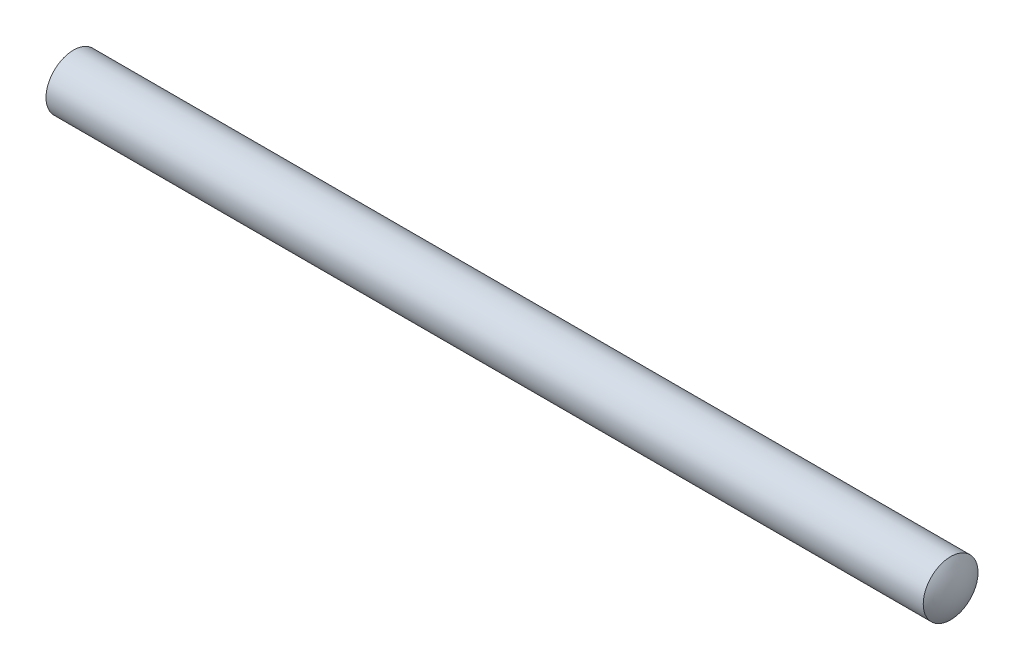
ISO-10303-21;
HEADER;
FILE_DESCRIPTION(('STEP AP214'),'2;1');
FILE_NAME('part.step','',(''),(''),'','','');
FILE_SCHEMA(('AUTOMOTIVE_DESIGN { 1 0 10303 214 1 1 1 1 }'));
ENDSEC;
DATA;
#1=APPLICATION_CONTEXT('core data for automotive mechanical design processes');
#2=APPLICATION_PROTOCOL_DEFINITION('international standard','automotive_design',2000,#1);
#3=PRODUCT_CONTEXT('',#1,'mechanical');
#4=PRODUCT('Part','Part','',(#3));
#5=PRODUCT_RELATED_PRODUCT_CATEGORY('part','',(#4));
#6=PRODUCT_DEFINITION_FORMATION('','',#4);
#7=PRODUCT_DEFINITION_CONTEXT('part definition',#1,'design');
#8=PRODUCT_DEFINITION('design','',#6,#7);
#9=PRODUCT_DEFINITION_SHAPE('','',#8);
#10=(LENGTH_UNIT() NAMED_UNIT(*) SI_UNIT(.MILLI.,.METRE.));
#11=(NAMED_UNIT(*) PLANE_ANGLE_UNIT() SI_UNIT($,.RADIAN.));
#12=(NAMED_UNIT(*) SI_UNIT($,.STERADIAN.) SOLID_ANGLE_UNIT());
#13=UNCERTAINTY_MEASURE_WITH_UNIT(LENGTH_MEASURE(1.E-05),#10,'distance_accuracy_value','');
#14=(GEOMETRIC_REPRESENTATION_CONTEXT(3) GLOBAL_UNCERTAINTY_ASSIGNED_CONTEXT((#13)) GLOBAL_UNIT_ASSIGNED_CONTEXT((#10,
#11,#12)) REPRESENTATION_CONTEXT('',''));
#15=CARTESIAN_POINT('',(0.,0.,0.));
#16=DIRECTION('',(0.,0.,1.));
#17=DIRECTION('',(1.,0.,0.));
#18=AXIS2_PLACEMENT_3D('',#15,#16,#17);
#19=CARTESIAN_POINT('',(44.835192090802,-7.21644966006352E-13,0.));
#20=DIRECTION('',(-1.,0.,0.));
#21=DIRECTION('',(0.,0.,1.00000000000001));
#22=AXIS2_PLACEMENT_3D('',#19,#20,#21);
#23=CYLINDRICAL_SURFACE('',#22,2.38125);
#24=CARTESIAN_POINT('',(38.1000000000002,0.,0.));
#25=DIRECTION('',(-1.,0.,0.));
#26=DIRECTION('',(0.,0.,1.00000000000001));
#27=AXIS2_PLACEMENT_3D('',#24,#25,#26);
#28=CIRCLE('',#27,2.38125);
#29=CARTESIAN_POINT('',(38.1000000000002,0.,2.38125000000002));
#30=VERTEX_POINT('',#29);
#31=EDGE_CURVE('E39',#30,#30,#28,.T.);
#32=ORIENTED_EDGE('',*,*,#31,.T.);
#33=EDGE_LOOP('',(#32));
#34=FACE_BOUND('',#33,.T.);
#35=CARTESIAN_POINT('',(-38.0999999999998,-7.21644966006352E-13,0.));
#36=DIRECTION('',(1.,0.,0.));
#37=DIRECTION('',(0.,0.,-1.00000000000001));
#38=AXIS2_PLACEMENT_3D('',#35,#36,#37);
#39=CIRCLE('',#38,2.38125);
#40=CARTESIAN_POINT('',(-38.0999999999998,-7.24520009959262E-13,-2.38125000000007));
#41=VERTEX_POINT('',#40);
#42=EDGE_CURVE('E10',#41,#41,#39,.F.);
#43=ORIENTED_EDGE('',*,*,#42,.F.);
#44=EDGE_LOOP('',(#43));
#45=FACE_BOUND('',#44,.T.);
#46=ADVANCED_FACE('F33',(#34,#45),#23,.T.);
#47=CARTESIAN_POINT('',(-38.1,2.36213323771411,-0.301128095312048));
#48=DIRECTION('',(1.,0.,0.));
#49=DIRECTION('',(0.,0.12645799278195,0.99197196334452));
#50=AXIS2_PLACEMENT_3D('',#47,#48,#49);
#51=PLANE('',#50);
#52=ORIENTED_EDGE('',*,*,#42,.T.);
#53=EDGE_LOOP('',(#52));
#54=FACE_BOUND('',#53,.T.);
#55=ADVANCED_FACE('F49',(#54),#51,.F.);
#56=CARTESIAN_POINT('',(34.9250000000001,0.,0.));
#57=DIRECTION('',(-1.,0.,0.));
#58=DIRECTION('',(0.,0.,1.00000000000001));
#59=AXIS2_PLACEMENT_3D('',#56,#57,#58);
#60=SPHERICAL_SURFACE('',#59,3.96875);
#61=ORIENTED_EDGE('',*,*,#31,.F.);
#62=EDGE_LOOP('',(#61));
#63=FACE_BOUND('',#62,.T.);
#64=ADVANCED_FACE('F47',(#63),#60,.T.);
#65=CLOSED_SHELL('',(#46,#55,#64));
#66=MANIFOLD_SOLID_BREP('B2',#65);
#67=ADVANCED_BREP_SHAPE_REPRESENTATION('',(#18,#66),#14);
#68=SHAPE_DEFINITION_REPRESENTATION(#9,#67);
ENDSEC;
END-ISO-10303-21;
